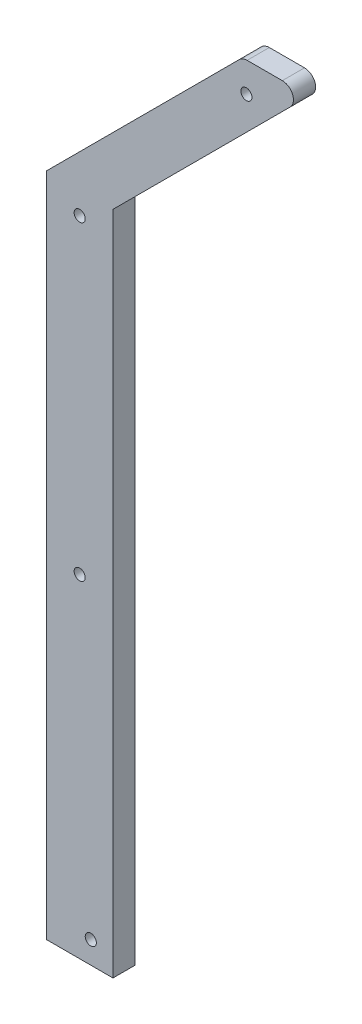
ISO-10303-21;
HEADER;
FILE_DESCRIPTION(('STEP AP214'),'2;1');
FILE_NAME('part.step','',(''),(''),'','','');
FILE_SCHEMA(('AUTOMOTIVE_DESIGN { 1 0 10303 214 1 1 1 1 }'));
ENDSEC;
DATA;
#1=APPLICATION_CONTEXT('core data for automotive mechanical design processes');
#2=APPLICATION_PROTOCOL_DEFINITION('international standard','automotive_design',2000,#1);
#3=PRODUCT_CONTEXT('',#1,'mechanical');
#4=PRODUCT('Part','Part','',(#3));
#5=PRODUCT_RELATED_PRODUCT_CATEGORY('part','',(#4));
#6=PRODUCT_DEFINITION_FORMATION('','',#4);
#7=PRODUCT_DEFINITION_CONTEXT('part definition',#1,'design');
#8=PRODUCT_DEFINITION('design','',#6,#7);
#9=PRODUCT_DEFINITION_SHAPE('','',#8);
#10=(LENGTH_UNIT() NAMED_UNIT(*) SI_UNIT(.MILLI.,.METRE.));
#11=(NAMED_UNIT(*) PLANE_ANGLE_UNIT() SI_UNIT($,.RADIAN.));
#12=(NAMED_UNIT(*) SI_UNIT($,.STERADIAN.) SOLID_ANGLE_UNIT());
#13=UNCERTAINTY_MEASURE_WITH_UNIT(LENGTH_MEASURE(1.E-05),#10,'distance_accuracy_value','');
#14=(GEOMETRIC_REPRESENTATION_CONTEXT(3) GLOBAL_UNCERTAINTY_ASSIGNED_CONTEXT((#13)) GLOBAL_UNIT_ASSIGNED_CONTEXT((#10,
#11,#12)) REPRESENTATION_CONTEXT('',''));
#15=CARTESIAN_POINT('',(0.,0.,0.));
#16=DIRECTION('',(0.,0.,1.));
#17=DIRECTION('',(1.,0.,0.));
#18=AXIS2_PLACEMENT_3D('',#15,#16,#17);
#19=CARTESIAN_POINT('',(0.,-190.5,12.7));
#20=DIRECTION('',(0.,1.,0.));
#21=DIRECTION('',(0.,0.,1.));
#22=AXIS2_PLACEMENT_3D('',#19,#20,#21);
#23=PLANE('',#22);
#24=DIRECTION('',(1.,0.,0.));
#25=VECTOR('',#24,1.);
#26=CARTESIAN_POINT('',(0.,-190.5,0.));
#27=LINE('',#26,#25);
#28=CARTESIAN_POINT('',(-19.05,-190.5,0.));
#29=VERTEX_POINT('',#28);
#30=CARTESIAN_POINT('',(19.05,-190.5,0.));
#31=VERTEX_POINT('',#30);
#32=EDGE_CURVE('E143',#29,#31,#27,.T.);
#33=ORIENTED_EDGE('',*,*,#32,.T.);
#34=DIRECTION('',(0.,0.,-1.));
#35=VECTOR('',#34,1.);
#36=CARTESIAN_POINT('',(19.05,-190.5,12.7));
#37=LINE('',#36,#35);
#38=CARTESIAN_POINT('',(19.05,-190.5,12.7));
#39=VERTEX_POINT('',#38);
#40=EDGE_CURVE('E11',#39,#31,#37,.T.);
#41=ORIENTED_EDGE('',*,*,#40,.F.);
#42=DIRECTION('',(1.,0.,0.));
#43=VECTOR('',#42,1.);
#44=CARTESIAN_POINT('',(0.,-190.5,12.7));
#45=LINE('',#44,#43);
#46=CARTESIAN_POINT('',(-19.05,-190.5,12.7));
#47=VERTEX_POINT('',#46);
#48=EDGE_CURVE('E169',#47,#39,#45,.T.);
#49=ORIENTED_EDGE('',*,*,#48,.F.);
#50=DIRECTION('',(0.,0.,-1.));
#51=VECTOR('',#50,1.);
#52=CARTESIAN_POINT('',(-19.05,-190.5,12.7));
#53=LINE('',#52,#51);
#54=EDGE_CURVE('E59',#47,#29,#53,.T.);
#55=ORIENTED_EDGE('',*,*,#54,.T.);
#56=EDGE_LOOP('',(#33,#41,#49,#55));
#57=FACE_BOUND('',#56,.T.);
#58=ADVANCED_FACE('F40',(#57),#23,.F.);
#59=CARTESIAN_POINT('',(19.05,0.,12.7));
#60=DIRECTION('',(-1.,0.,0.));
#61=DIRECTION('',(0.,0.,1.));
#62=AXIS2_PLACEMENT_3D('',#59,#60,#61);
#63=PLANE('',#62);
#64=DIRECTION('',(0.,1.,0.));
#65=VECTOR('',#64,1.);
#66=CARTESIAN_POINT('',(19.05,0.,0.));
#67=LINE('',#66,#65);
#68=CARTESIAN_POINT('',(19.05,190.5,0.));
#69=VERTEX_POINT('',#68);
#70=EDGE_CURVE('E146',#31,#69,#67,.T.);
#71=ORIENTED_EDGE('',*,*,#70,.T.);
#72=DIRECTION('',(0.,0.,-1.));
#73=VECTOR('',#72,1.);
#74=CARTESIAN_POINT('',(19.05,190.5,12.7));
#75=LINE('',#74,#73);
#76=CARTESIAN_POINT('',(19.05,190.5,12.7));
#77=VERTEX_POINT('',#76);
#78=EDGE_CURVE('E50',#77,#69,#75,.T.);
#79=ORIENTED_EDGE('',*,*,#78,.F.);
#80=DIRECTION('',(0.,1.,0.));
#81=VECTOR('',#80,1.);
#82=CARTESIAN_POINT('',(19.05,0.,12.7));
#83=LINE('',#82,#81);
#84=EDGE_CURVE('E97',#39,#77,#83,.T.);
#85=ORIENTED_EDGE('',*,*,#84,.F.);
#86=ORIENTED_EDGE('',*,*,#40,.T.);
#87=EDGE_LOOP('',(#71,#79,#85,#86));
#88=FACE_BOUND('',#87,.T.);
#89=ADVANCED_FACE('F252',(#88),#63,.F.);
#90=CARTESIAN_POINT('',(-85.7250000000001,85.7250000000001,12.7));
#91=DIRECTION('',(-0.707106781186548,0.707106781186547,0.));
#92=DIRECTION('',(-0.707106781186547,-0.707106781186548,0.));
#93=AXIS2_PLACEMENT_3D('',#90,#91,#92);
#94=PLANE('',#93);
#95=DIRECTION('',(0.707106781186547,0.707106781186548,0.));
#96=VECTOR('',#95,1.);
#97=CARTESIAN_POINT('',(-85.7250000000001,85.7250000000001,0.));
#98=LINE('',#97,#96);
#99=CARTESIAN_POINT('',(120.46307345283,291.91307345283,0.));
#100=VERTEX_POINT('',#99);
#101=EDGE_CURVE('E150',#69,#100,#98,.T.);
#102=ORIENTED_EDGE('',*,*,#101,.T.);
#103=DIRECTION('',(0.,0.,-1.));
#104=VECTOR('',#103,1.);
#105=CARTESIAN_POINT('',(120.46307345283,291.91307345283,12.7));
#106=LINE('',#105,#104);
#107=CARTESIAN_POINT('',(120.46307345283,291.91307345283,12.7));
#108=VERTEX_POINT('',#107);
#109=EDGE_CURVE('E180',#108,#100,#106,.T.);
#110=ORIENTED_EDGE('',*,*,#109,.F.);
#111=DIRECTION('',(0.707106781186547,0.707106781186548,0.));
#112=VECTOR('',#111,1.);
#113=CARTESIAN_POINT('',(-85.7250000000001,85.7250000000001,12.7));
#114=LINE('',#113,#112);
#115=EDGE_CURVE('E221',#77,#108,#114,.T.);
#116=ORIENTED_EDGE('',*,*,#115,.F.);
#117=ORIENTED_EDGE('',*,*,#78,.T.);
#118=EDGE_LOOP('',(#102,#110,#116,#117));
#119=FACE_BOUND('',#118,.T.);
#120=ADVANCED_FACE('F256',(#119),#94,.F.);
#121=CARTESIAN_POINT('',(115.972945392295,296.403201513365,12.7));
#122=DIRECTION('',(0.,0.,-1.));
#123=DIRECTION('',(-1.,0.,0.));
#124=AXIS2_PLACEMENT_3D('',#121,#122,#123);
#125=CYLINDRICAL_SURFACE('',#124,6.35000000000001);
#126=CARTESIAN_POINT('',(115.972945392295,296.403201513365,0.));
#127=DIRECTION('',(0.,0.,1.));
#128=DIRECTION('',(1.,0.,0.));
#129=AXIS2_PLACEMENT_3D('',#126,#127,#128);
#130=CIRCLE('',#129,6.35000000000001);
#131=CARTESIAN_POINT('',(115.972945392295,302.753201513365,0.));
#132=VERTEX_POINT('',#131);
#133=EDGE_CURVE('E153',#100,#132,#130,.T.);
#134=ORIENTED_EDGE('',*,*,#133,.T.);
#135=DIRECTION('',(0.,0.,-1.));
#136=VECTOR('',#135,1.);
#137=CARTESIAN_POINT('',(115.972945392295,302.753201513365,12.7));
#138=LINE('',#137,#136);
#139=CARTESIAN_POINT('',(115.972945392295,302.753201513365,12.7));
#140=VERTEX_POINT('',#139);
#141=EDGE_CURVE('E176',#140,#132,#138,.T.);
#142=ORIENTED_EDGE('',*,*,#141,.F.);
#143=CARTESIAN_POINT('',(115.972945392295,296.403201513365,12.7));
#144=DIRECTION('',(0.,0.,1.));
#145=DIRECTION('',(1.,0.,0.));
#146=AXIS2_PLACEMENT_3D('',#143,#144,#145);
#147=CIRCLE('',#146,6.35000000000001);
#148=EDGE_CURVE('E224',#108,#140,#147,.T.);
#149=ORIENTED_EDGE('',*,*,#148,.F.);
#150=ORIENTED_EDGE('',*,*,#109,.T.);
#151=EDGE_LOOP('',(#134,#142,#149,#150));
#152=FACE_BOUND('',#151,.T.);
#153=ADVANCED_FACE('F232',(#152),#125,.T.);
#154=CARTESIAN_POINT('',(0.,302.753201513365,12.7));
#155=DIRECTION('',(0.,-1.,0.));
#156=DIRECTION('',(0.,0.,-1.));
#157=AXIS2_PLACEMENT_3D('',#154,#155,#156);
#158=PLANE('',#157);
#159=DIRECTION('',(-1.,0.,0.));
#160=VECTOR('',#159,1.);
#161=CARTESIAN_POINT('',(0.,302.753201513365,0.));
#162=LINE('',#161,#160);
#163=CARTESIAN_POINT('',(95.8334576344336,302.753201513365,0.));
#164=VERTEX_POINT('',#163);
#165=EDGE_CURVE('E156',#132,#164,#162,.T.);
#166=ORIENTED_EDGE('',*,*,#165,.T.);
#167=DIRECTION('',(0.,0.,-1.));
#168=VECTOR('',#167,1.);
#169=CARTESIAN_POINT('',(95.8334576344336,302.753201513365,12.7));
#170=LINE('',#169,#168);
#171=CARTESIAN_POINT('',(95.8334576344336,302.753201513365,12.7));
#172=VERTEX_POINT('',#171);
#173=EDGE_CURVE('E123',#172,#164,#170,.T.);
#174=ORIENTED_EDGE('',*,*,#173,.F.);
#175=DIRECTION('',(-1.,0.,0.));
#176=VECTOR('',#175,1.);
#177=CARTESIAN_POINT('',(0.,302.753201513365,12.7));
#178=LINE('',#177,#176);
#179=EDGE_CURVE('E131',#140,#172,#178,.T.);
#180=ORIENTED_EDGE('',*,*,#179,.F.);
#181=ORIENTED_EDGE('',*,*,#141,.T.);
#182=EDGE_LOOP('',(#166,#174,#180,#181));
#183=FACE_BOUND('',#182,.T.);
#184=ADVANCED_FACE('F236',(#183),#158,.F.);
#185=CARTESIAN_POINT('',(95.8334576344336,296.403201513365,12.7));
#186=DIRECTION('',(0.,0.,-1.));
#187=DIRECTION('',(-1.,0.,0.));
#188=AXIS2_PLACEMENT_3D('',#185,#186,#187);
#189=CYLINDRICAL_SURFACE('',#188,6.35000000000001);
#190=CARTESIAN_POINT('',(95.8334576344336,296.403201513365,0.));
#191=DIRECTION('',(0.,0.,1.));
#192=DIRECTION('',(1.,0.,0.));
#193=AXIS2_PLACEMENT_3D('',#190,#191,#192);
#194=CIRCLE('',#193,6.35000000000001);
#195=CARTESIAN_POINT('',(91.343329573899,300.893329573899,0.));
#196=VERTEX_POINT('',#195);
#197=EDGE_CURVE('E118',#196,#164,#194,.F.);
#198=ORIENTED_EDGE('',*,*,#197,.F.);
#199=DIRECTION('',(0.,0.,-1.));
#200=VECTOR('',#199,1.);
#201=CARTESIAN_POINT('',(91.343329573899,300.893329573899,12.7));
#202=LINE('',#201,#200);
#203=CARTESIAN_POINT('',(91.343329573899,300.893329573899,12.7));
#204=VERTEX_POINT('',#203);
#205=EDGE_CURVE('E113',#204,#196,#202,.T.);
#206=ORIENTED_EDGE('',*,*,#205,.F.);
#207=CARTESIAN_POINT('',(95.8334576344336,296.403201513365,12.7));
#208=DIRECTION('',(0.,0.,1.));
#209=DIRECTION('',(1.,0.,0.));
#210=AXIS2_PLACEMENT_3D('',#207,#208,#209);
#211=CIRCLE('',#210,6.35000000000001);
#212=EDGE_CURVE('E116',#204,#172,#211,.F.);
#213=ORIENTED_EDGE('',*,*,#212,.T.);
#214=ORIENTED_EDGE('',*,*,#173,.T.);
#215=EDGE_LOOP('',(#198,#206,#213,#214));
#216=FACE_BOUND('',#215,.T.);
#217=ADVANCED_FACE('F115',(#216),#189,.T.);
#218=CARTESIAN_POINT('',(-104.775,104.775,12.7));
#219=DIRECTION('',(-0.707106781186548,0.707106781186548,0.));
#220=DIRECTION('',(-0.707106781186548,-0.707106781186548,0.));
#221=AXIS2_PLACEMENT_3D('',#218,#219,#220);
#222=PLANE('',#221);
#223=DIRECTION('',(0.707106781186548,0.707106781186548,0.));
#224=VECTOR('',#223,1.);
#225=CARTESIAN_POINT('',(-104.775,104.775,0.));
#226=LINE('',#225,#224);
#227=CARTESIAN_POINT('',(-19.05,190.5,0.));
#228=VERTEX_POINT('',#227);
#229=EDGE_CURVE('E162',#228,#196,#226,.T.);
#230=ORIENTED_EDGE('',*,*,#229,.F.);
#231=DIRECTION('',(0.,0.,-1.));
#232=VECTOR('',#231,1.);
#233=CARTESIAN_POINT('',(-19.05,190.5,12.7));
#234=LINE('',#233,#232);
#235=CARTESIAN_POINT('',(-19.05,190.5,12.7));
#236=VERTEX_POINT('',#235);
#237=EDGE_CURVE('E85',#236,#228,#234,.T.);
#238=ORIENTED_EDGE('',*,*,#237,.F.);
#239=DIRECTION('',(0.707106781186548,0.707106781186548,0.));
#240=VECTOR('',#239,1.);
#241=CARTESIAN_POINT('',(-104.775,104.775,12.7));
#242=LINE('',#241,#240);
#243=EDGE_CURVE('E129',#236,#204,#242,.T.);
#244=ORIENTED_EDGE('',*,*,#243,.T.);
#245=ORIENTED_EDGE('',*,*,#205,.T.);
#246=EDGE_LOOP('',(#230,#238,#244,#245));
#247=FACE_BOUND('',#246,.T.);
#248=ADVANCED_FACE('F135',(#247),#222,.T.);
#249=CARTESIAN_POINT('',(-19.05,0.,12.7));
#250=DIRECTION('',(-1.,0.,0.));
#251=DIRECTION('',(0.,0.,1.));
#252=AXIS2_PLACEMENT_3D('',#249,#250,#251);
#253=PLANE('',#252);
#254=DIRECTION('',(0.,1.,0.));
#255=VECTOR('',#254,1.);
#256=CARTESIAN_POINT('',(-19.05,0.,0.));
#257=LINE('',#256,#255);
#258=EDGE_CURVE('E165',#29,#228,#257,.T.);
#259=ORIENTED_EDGE('',*,*,#258,.F.);
#260=ORIENTED_EDGE('',*,*,#54,.F.);
#261=DIRECTION('',(0.,1.,0.));
#262=VECTOR('',#261,1.);
#263=CARTESIAN_POINT('',(-19.05,0.,12.7));
#264=LINE('',#263,#262);
#265=EDGE_CURVE('E137',#47,#236,#264,.T.);
#266=ORIENTED_EDGE('',*,*,#265,.T.);
#267=ORIENTED_EDGE('',*,*,#237,.T.);
#268=EDGE_LOOP('',(#259,#260,#266,#267));
#269=FACE_BOUND('',#268,.T.);
#270=ADVANCED_FACE('F239',(#269),#253,.T.);
#271=CARTESIAN_POINT('',(0.,0.,12.7));
#272=DIRECTION('',(0.,0.,1.));
#273=DIRECTION('',(1.,0.,0.));
#274=AXIS2_PLACEMENT_3D('',#271,#272,#273);
#275=PLANE('',#274);
#276=CARTESIAN_POINT('',(0.,177.8,12.7));
#277=DIRECTION('',(0.,0.,1.));
#278=DIRECTION('',(1.,0.,0.));
#279=AXIS2_PLACEMENT_3D('',#276,#277,#278);
#280=CIRCLE('',#279,3.175);
#281=CARTESIAN_POINT('',(3.17500000000001,177.8,12.7));
#282=VERTEX_POINT('',#281);
#283=EDGE_CURVE('E211',#282,#282,#280,.T.);
#284=ORIENTED_EDGE('',*,*,#283,.F.);
#285=EDGE_LOOP('',(#284));
#286=FACE_BOUND('',#285,.T.);
#287=CARTESIAN_POINT('',(6.35,-177.8,12.7));
#288=DIRECTION('',(0.,0.,1.));
#289=DIRECTION('',(1.,0.,0.));
#290=AXIS2_PLACEMENT_3D('',#287,#288,#289);
#291=CIRCLE('',#290,3.175);
#292=CARTESIAN_POINT('',(9.52500000000001,-177.8,12.7));
#293=VERTEX_POINT('',#292);
#294=EDGE_CURVE('E198',#293,#293,#291,.T.);
#295=ORIENTED_EDGE('',*,*,#294,.F.);
#296=EDGE_LOOP('',(#295));
#297=FACE_BOUND('',#296,.T.);
#298=CARTESIAN_POINT('',(0.,0.,12.7));
#299=DIRECTION('',(0.,0.,1.));
#300=DIRECTION('',(1.,0.,0.));
#301=AXIS2_PLACEMENT_3D('',#298,#299,#300);
#302=CIRCLE('',#301,3.175);
#303=CARTESIAN_POINT('',(3.175,0.,12.7));
#304=VERTEX_POINT('',#303);
#305=EDGE_CURVE('E194',#304,#304,#302,.T.);
#306=ORIENTED_EDGE('',*,*,#305,.F.);
#307=EDGE_LOOP('',(#306));
#308=FACE_BOUND('',#307,.T.);
#309=CARTESIAN_POINT('',(95.396679575531,285.761768630303,12.7));
#310=DIRECTION('',(0.,0.,1.));
#311=DIRECTION('',(1.,0.,0.));
#312=AXIS2_PLACEMENT_3D('',#309,#310,#311);
#313=CIRCLE('',#312,3.175);
#314=CARTESIAN_POINT('',(98.571679575531,285.761768630303,12.7));
#315=VERTEX_POINT('',#314);
#316=EDGE_CURVE('E190',#315,#315,#313,.T.);
#317=ORIENTED_EDGE('',*,*,#316,.F.);
#318=EDGE_LOOP('',(#317));
#319=FACE_BOUND('',#318,.T.);
#320=ORIENTED_EDGE('',*,*,#48,.T.);
#321=ORIENTED_EDGE('',*,*,#84,.T.);
#322=ORIENTED_EDGE('',*,*,#115,.T.);
#323=ORIENTED_EDGE('',*,*,#148,.T.);
#324=ORIENTED_EDGE('',*,*,#179,.T.);
#325=ORIENTED_EDGE('',*,*,#212,.F.);
#326=ORIENTED_EDGE('',*,*,#243,.F.);
#327=ORIENTED_EDGE('',*,*,#265,.F.);
#328=EDGE_LOOP('',(#320,#321,#322,#323,#324,#325,#326,#327));
#329=FACE_BOUND('',#328,.T.);
#330=ADVANCED_FACE('F127',(#286,#297,#308,#319,#329),#275,.T.);
#331=CARTESIAN_POINT('',(0.,0.,0.));
#332=DIRECTION('',(0.,0.,1.));
#333=DIRECTION('',(1.,0.,0.));
#334=AXIS2_PLACEMENT_3D('',#331,#332,#333);
#335=PLANE('',#334);
#336=CARTESIAN_POINT('',(0.,177.8,0.));
#337=DIRECTION('',(0.,0.,1.));
#338=DIRECTION('',(1.,0.,0.));
#339=AXIS2_PLACEMENT_3D('',#336,#337,#338);
#340=CIRCLE('',#339,3.175);
#341=CARTESIAN_POINT('',(3.17500000000001,177.8,0.));
#342=VERTEX_POINT('',#341);
#343=EDGE_CURVE('E43',#342,#342,#340,.T.);
#344=ORIENTED_EDGE('',*,*,#343,.T.);
#345=EDGE_LOOP('',(#344));
#346=FACE_BOUND('',#345,.T.);
#347=CARTESIAN_POINT('',(6.35,-177.8,0.));
#348=DIRECTION('',(0.,0.,1.));
#349=DIRECTION('',(1.,0.,0.));
#350=AXIS2_PLACEMENT_3D('',#347,#348,#349);
#351=CIRCLE('',#350,3.175);
#352=CARTESIAN_POINT('',(9.52500000000001,-177.8,0.));
#353=VERTEX_POINT('',#352);
#354=EDGE_CURVE('E195',#353,#353,#351,.T.);
#355=ORIENTED_EDGE('',*,*,#354,.T.);
#356=EDGE_LOOP('',(#355));
#357=FACE_BOUND('',#356,.T.);
#358=CARTESIAN_POINT('',(0.,0.,0.));
#359=DIRECTION('',(0.,0.,1.));
#360=DIRECTION('',(1.,0.,0.));
#361=AXIS2_PLACEMENT_3D('',#358,#359,#360);
#362=CIRCLE('',#361,3.175);
#363=CARTESIAN_POINT('',(3.175,0.,0.));
#364=VERTEX_POINT('',#363);
#365=EDGE_CURVE('E191',#364,#364,#362,.T.);
#366=ORIENTED_EDGE('',*,*,#365,.T.);
#367=EDGE_LOOP('',(#366));
#368=FACE_BOUND('',#367,.T.);
#369=CARTESIAN_POINT('',(95.396679575531,285.761768630303,0.));
#370=DIRECTION('',(0.,0.,1.));
#371=DIRECTION('',(1.,0.,0.));
#372=AXIS2_PLACEMENT_3D('',#369,#370,#371);
#373=CIRCLE('',#372,3.175);
#374=CARTESIAN_POINT('',(98.571679575531,285.761768630303,0.));
#375=VERTEX_POINT('',#374);
#376=EDGE_CURVE('E147',#375,#375,#373,.T.);
#377=ORIENTED_EDGE('',*,*,#376,.T.);
#378=EDGE_LOOP('',(#377));
#379=FACE_BOUND('',#378,.T.);
#380=ORIENTED_EDGE('',*,*,#32,.F.);
#381=ORIENTED_EDGE('',*,*,#258,.T.);
#382=ORIENTED_EDGE('',*,*,#229,.T.);
#383=ORIENTED_EDGE('',*,*,#197,.T.);
#384=ORIENTED_EDGE('',*,*,#165,.F.);
#385=ORIENTED_EDGE('',*,*,#133,.F.);
#386=ORIENTED_EDGE('',*,*,#101,.F.);
#387=ORIENTED_EDGE('',*,*,#70,.F.);
#388=EDGE_LOOP('',(#380,#381,#382,#383,#384,#385,#386,#387));
#389=FACE_BOUND('',#388,.T.);
#390=ADVANCED_FACE('F238',(#346,#357,#368,#379,#389),#335,.F.);
#391=CARTESIAN_POINT('',(95.396679575531,285.761768630303,-850.9));
#392=DIRECTION('',(0.,0.,1.));
#393=DIRECTION('',(1.,0.,0.));
#394=AXIS2_PLACEMENT_3D('',#391,#392,#393);
#395=CYLINDRICAL_SURFACE('',#394,3.175);
#396=ORIENTED_EDGE('',*,*,#316,.T.);
#397=EDGE_LOOP('',(#396));
#398=FACE_BOUND('',#397,.T.);
#399=ORIENTED_EDGE('',*,*,#376,.F.);
#400=EDGE_LOOP('',(#399));
#401=FACE_BOUND('',#400,.T.);
#402=ADVANCED_FACE('F288',(#398,#401),#395,.F.);
#403=CARTESIAN_POINT('',(0.,0.,-23.3));
#404=DIRECTION('',(0.,0.,1.));
#405=DIRECTION('',(1.,0.,0.));
#406=AXIS2_PLACEMENT_3D('',#403,#404,#405);
#407=CYLINDRICAL_SURFACE('',#406,3.175);
#408=ORIENTED_EDGE('',*,*,#305,.T.);
#409=EDGE_LOOP('',(#408));
#410=FACE_BOUND('',#409,.T.);
#411=ORIENTED_EDGE('',*,*,#365,.F.);
#412=EDGE_LOOP('',(#411));
#413=FACE_BOUND('',#412,.T.);
#414=ADVANCED_FACE('F293',(#410,#413),#407,.F.);
#415=CARTESIAN_POINT('',(6.35,-177.8,-39.878));
#416=DIRECTION('',(0.,0.,1.));
#417=DIRECTION('',(1.,0.,0.));
#418=AXIS2_PLACEMENT_3D('',#415,#416,#417);
#419=CYLINDRICAL_SURFACE('',#418,3.175);
#420=ORIENTED_EDGE('',*,*,#294,.T.);
#421=EDGE_LOOP('',(#420));
#422=FACE_BOUND('',#421,.T.);
#423=ORIENTED_EDGE('',*,*,#354,.F.);
#424=EDGE_LOOP('',(#423));
#425=FACE_BOUND('',#424,.T.);
#426=ADVANCED_FACE('F305',(#422,#425),#419,.F.);
#427=CARTESIAN_POINT('',(0.,177.8,-135.382));
#428=DIRECTION('',(0.,0.,1.));
#429=DIRECTION('',(1.,0.,0.));
#430=AXIS2_PLACEMENT_3D('',#427,#428,#429);
#431=CYLINDRICAL_SURFACE('',#430,3.175);
#432=ORIENTED_EDGE('',*,*,#283,.T.);
#433=EDGE_LOOP('',(#432));
#434=FACE_BOUND('',#433,.T.);
#435=ORIENTED_EDGE('',*,*,#343,.F.);
#436=EDGE_LOOP('',(#435));
#437=FACE_BOUND('',#436,.T.);
#438=ADVANCED_FACE('F314',(#434,#437),#431,.F.);
#439=CLOSED_SHELL('',(#58,#89,#120,#153,#184,#217,#248,#270,#330,#390,#402,#414,#426,#438));
#440=MANIFOLD_SOLID_BREP('B2',#439);
#441=ADVANCED_BREP_SHAPE_REPRESENTATION('',(#18,#440),#14);
#442=SHAPE_DEFINITION_REPRESENTATION(#9,#441);
ENDSEC;
END-ISO-10303-21;
